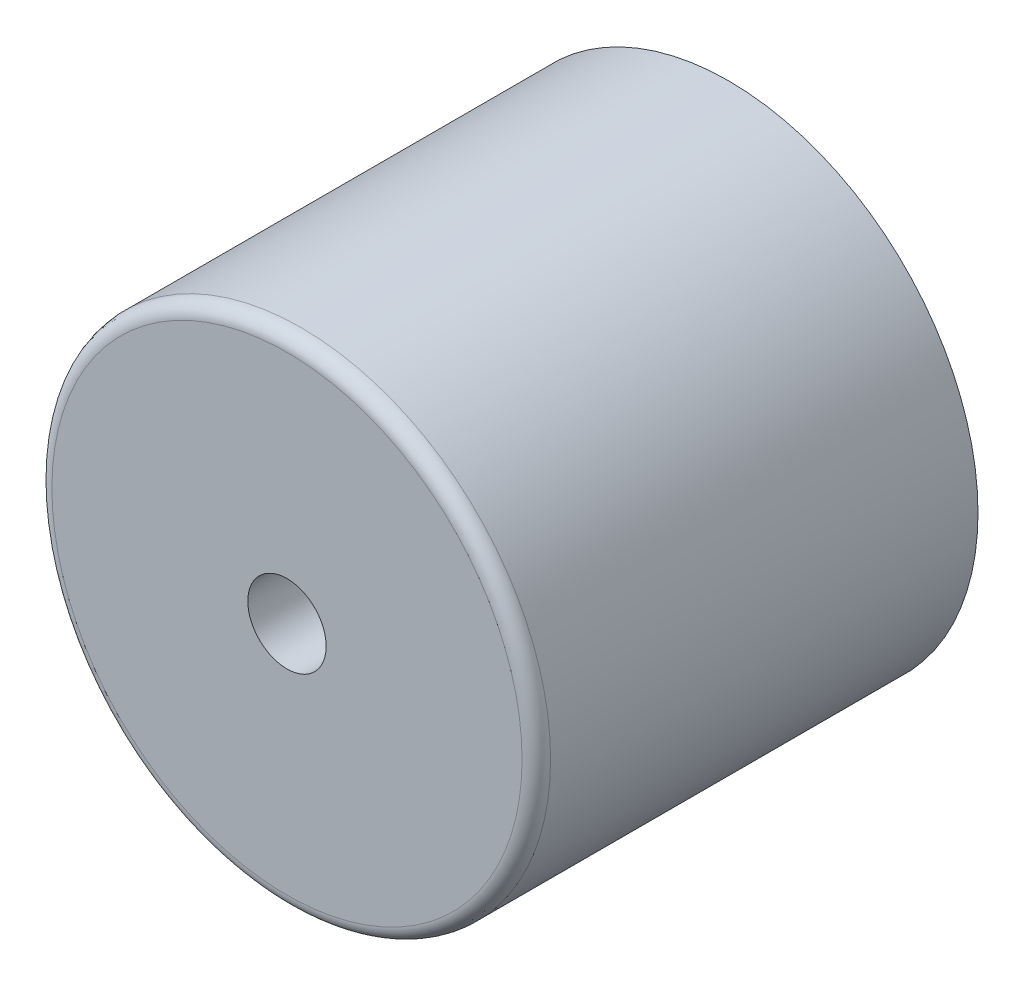
ISO-10303-21;
HEADER;
FILE_DESCRIPTION(('STEP AP214'),'2;1');
FILE_NAME('part.step','',(''),(''),'','','');
FILE_SCHEMA(('AUTOMOTIVE_DESIGN { 1 0 10303 214 1 1 1 1 }'));
ENDSEC;
DATA;
#1=APPLICATION_CONTEXT('core data for automotive mechanical design processes');
#2=APPLICATION_PROTOCOL_DEFINITION('international standard','automotive_design',2000,#1);
#3=PRODUCT_CONTEXT('',#1,'mechanical');
#4=PRODUCT('Part','Part','',(#3));
#5=PRODUCT_RELATED_PRODUCT_CATEGORY('part','',(#4));
#6=PRODUCT_DEFINITION_FORMATION('','',#4);
#7=PRODUCT_DEFINITION_CONTEXT('part definition',#1,'design');
#8=PRODUCT_DEFINITION('design','',#6,#7);
#9=PRODUCT_DEFINITION_SHAPE('','',#8);
#10=(LENGTH_UNIT() NAMED_UNIT(*) SI_UNIT(.MILLI.,.METRE.));
#11=(NAMED_UNIT(*) PLANE_ANGLE_UNIT() SI_UNIT($,.RADIAN.));
#12=(NAMED_UNIT(*) SI_UNIT($,.STERADIAN.) SOLID_ANGLE_UNIT());
#13=UNCERTAINTY_MEASURE_WITH_UNIT(LENGTH_MEASURE(1.E-05),#10,'distance_accuracy_value','');
#14=(GEOMETRIC_REPRESENTATION_CONTEXT(3) GLOBAL_UNCERTAINTY_ASSIGNED_CONTEXT((#13)) GLOBAL_UNIT_ASSIGNED_CONTEXT((#10,
#11,#12)) REPRESENTATION_CONTEXT('',''));
#15=CARTESIAN_POINT('',(0.,0.,0.));
#16=DIRECTION('',(0.,0.,1.));
#17=DIRECTION('',(1.,0.,0.));
#18=AXIS2_PLACEMENT_3D('',#15,#16,#17);
#19=CARTESIAN_POINT('',(0.,0.,31.));
#20=DIRECTION('',(0.,0.,-1.));
#21=DIRECTION('',(-1.,0.,0.));
#22=AXIS2_PLACEMENT_3D('',#19,#20,#21);
#23=CYLINDRICAL_SURFACE('',#22,17.5);
#24=CARTESIAN_POINT('',(0.,0.,30.));
#25=DIRECTION('',(0.,0.,1.));
#26=DIRECTION('',(1.,0.,0.));
#27=AXIS2_PLACEMENT_3D('',#24,#25,#26);
#28=CIRCLE('',#27,17.5);
#29=CARTESIAN_POINT('',(17.5,0.,30.));
#30=VERTEX_POINT('',#29);
#31=EDGE_CURVE('E10',#30,#30,#28,.F.);
#32=ORIENTED_EDGE('',*,*,#31,.T.);
#33=EDGE_LOOP('',(#32));
#34=FACE_BOUND('',#33,.T.);
#35=CARTESIAN_POINT('',(0.,0.,0.));
#36=DIRECTION('',(0.,0.,1.));
#37=DIRECTION('',(1.,0.,0.));
#38=AXIS2_PLACEMENT_3D('',#35,#36,#37);
#39=CIRCLE('',#38,17.5);
#40=CARTESIAN_POINT('',(17.5,0.,0.));
#41=VERTEX_POINT('',#40);
#42=EDGE_CURVE('E50',#41,#41,#39,.T.);
#43=ORIENTED_EDGE('',*,*,#42,.T.);
#44=EDGE_LOOP('',(#43));
#45=FACE_BOUND('',#44,.T.);
#46=ADVANCED_FACE('F36',(#34,#45),#23,.T.);
#47=CARTESIAN_POINT('',(0.,0.,31.));
#48=DIRECTION('',(0.,0.,1.));
#49=DIRECTION('',(1.,0.,0.));
#50=AXIS2_PLACEMENT_3D('',#47,#48,#49);
#51=PLANE('',#50);
#52=CARTESIAN_POINT('',(0.,0.,31.));
#53=DIRECTION('',(0.,0.,1.));
#54=DIRECTION('',(1.,0.,0.));
#55=AXIS2_PLACEMENT_3D('',#52,#53,#54);
#56=CIRCLE('',#55,2.75);
#57=CARTESIAN_POINT('',(2.75,0.,31.));
#58=VERTEX_POINT('',#57);
#59=EDGE_CURVE('E72',#58,#58,#56,.T.);
#60=ORIENTED_EDGE('',*,*,#59,.F.);
#61=EDGE_LOOP('',(#60));
#62=FACE_BOUND('',#61,.T.);
#63=CARTESIAN_POINT('',(0.,0.,31.));
#64=DIRECTION('',(0.,0.,1.));
#65=DIRECTION('',(1.,0.,0.));
#66=AXIS2_PLACEMENT_3D('',#63,#64,#65);
#67=CIRCLE('',#66,16.5);
#68=CARTESIAN_POINT('',(16.5,0.,31.));
#69=VERTEX_POINT('',#68);
#70=EDGE_CURVE('E45',#69,#69,#67,.T.);
#71=ORIENTED_EDGE('',*,*,#70,.T.);
#72=EDGE_LOOP('',(#71));
#73=FACE_BOUND('',#72,.T.);
#74=ADVANCED_FACE('F106',(#62,#73),#51,.T.);
#75=CARTESIAN_POINT('',(0.,0.,0.));
#76=DIRECTION('',(0.,0.,1.));
#77=DIRECTION('',(1.,0.,0.));
#78=AXIS2_PLACEMENT_3D('',#75,#76,#77);
#79=PLANE('',#78);
#80=CARTESIAN_POINT('',(0.,0.,0.));
#81=DIRECTION('',(0.,0.,-1.));
#82=DIRECTION('',(-1.,0.,0.));
#83=AXIS2_PLACEMENT_3D('',#80,#81,#82);
#84=CIRCLE('',#83,16.);
#85=CARTESIAN_POINT('',(-16.,0.,0.));
#86=VERTEX_POINT('',#85);
#87=EDGE_CURVE('E64',#86,#86,#84,.T.);
#88=ORIENTED_EDGE('',*,*,#87,.F.);
#89=EDGE_LOOP('',(#88));
#90=FACE_BOUND('',#89,.T.);
#91=ORIENTED_EDGE('',*,*,#42,.F.);
#92=EDGE_LOOP('',(#91));
#93=FACE_BOUND('',#92,.T.);
#94=ADVANCED_FACE('F111',(#90,#93),#79,.F.);
#95=CARTESIAN_POINT('',(0.,0.,30.));
#96=DIRECTION('',(0.,0.,1.));
#97=DIRECTION('',(1.,0.,0.));
#98=AXIS2_PLACEMENT_3D('',#95,#96,#97);
#99=TOROIDAL_SURFACE('',#98,16.5,1.);
#100=ORIENTED_EDGE('',*,*,#31,.F.);
#101=EDGE_LOOP('',(#100));
#102=FACE_BOUND('',#101,.T.);
#103=ORIENTED_EDGE('',*,*,#70,.F.);
#104=EDGE_LOOP('',(#103));
#105=FACE_BOUND('',#104,.T.);
#106=ADVANCED_FACE('F38',(#102,#105),#99,.T.);
#107=CARTESIAN_POINT('',(0.,0.,0.));
#108=DIRECTION('',(0.,0.,-1.));
#109=DIRECTION('',(-1.,0.,0.));
#110=AXIS2_PLACEMENT_3D('',#107,#108,#109);
#111=CONICAL_SURFACE('',#110,16.,0.283794109208328);
#112=CARTESIAN_POINT('',(0.,0.,6.));
#113=DIRECTION('',(0.,0.,-1.));
#114=DIRECTION('',(-1.,0.,0.));
#115=AXIS2_PLACEMENT_3D('',#112,#113,#114);
#116=CIRCLE('',#115,14.25);
#117=CARTESIAN_POINT('',(-14.25,0.,6.));
#118=VERTEX_POINT('',#117);
#119=EDGE_CURVE('E60',#118,#118,#116,.T.);
#120=ORIENTED_EDGE('',*,*,#119,.F.);
#121=EDGE_LOOP('',(#120));
#122=FACE_BOUND('',#121,.T.);
#123=ORIENTED_EDGE('',*,*,#87,.T.);
#124=EDGE_LOOP('',(#123));
#125=FACE_BOUND('',#124,.T.);
#126=ADVANCED_FACE('F93',(#122,#125),#111,.F.);
#127=CARTESIAN_POINT('',(0.,0.,14.));
#128=DIRECTION('',(0.,0.,-1.));
#129=DIRECTION('',(-1.,0.,0.));
#130=AXIS2_PLACEMENT_3D('',#127,#128,#129);
#131=PLANE('',#130);
#132=CARTESIAN_POINT('',(0.,0.,14.));
#133=DIRECTION('',(0.,0.,-1.));
#134=DIRECTION('',(-1.,0.,0.));
#135=AXIS2_PLACEMENT_3D('',#132,#133,#134);
#136=CIRCLE('',#135,9.25);
#137=CARTESIAN_POINT('',(-9.24999999999999,0.,14.));
#138=VERTEX_POINT('',#137);
#139=EDGE_CURVE('E68',#138,#138,#136,.T.);
#140=ORIENTED_EDGE('',*,*,#139,.F.);
#141=EDGE_LOOP('',(#140));
#142=FACE_BOUND('',#141,.T.);
#143=CARTESIAN_POINT('',(0.,0.,14.));
#144=DIRECTION('',(0.,0.,-1.));
#145=DIRECTION('',(-1.,0.,0.));
#146=AXIS2_PLACEMENT_3D('',#143,#144,#145);
#147=CIRCLE('',#146,14.25);
#148=CARTESIAN_POINT('',(-14.25,0.,14.));
#149=VERTEX_POINT('',#148);
#150=EDGE_CURVE('E56',#149,#149,#147,.T.);
#151=ORIENTED_EDGE('',*,*,#150,.T.);
#152=EDGE_LOOP('',(#151));
#153=FACE_BOUND('',#152,.T.);
#154=ADVANCED_FACE('F90',(#142,#153),#131,.T.);
#155=CARTESIAN_POINT('',(0.,0.,14.));
#156=DIRECTION('',(0.,0.,-1.));
#157=DIRECTION('',(-1.,0.,0.));
#158=AXIS2_PLACEMENT_3D('',#155,#156,#157);
#159=CYLINDRICAL_SURFACE('',#158,14.25);
#160=ORIENTED_EDGE('',*,*,#119,.T.);
#161=EDGE_LOOP('',(#160));
#162=FACE_BOUND('',#161,.T.);
#163=ORIENTED_EDGE('',*,*,#150,.F.);
#164=EDGE_LOOP('',(#163));
#165=FACE_BOUND('',#164,.T.);
#166=ADVANCED_FACE('F86',(#162,#165),#159,.F.);
#167=CARTESIAN_POINT('',(0.,0.,18.7));
#168=DIRECTION('',(0.,0.,-1.));
#169=DIRECTION('',(-1.,0.,0.));
#170=AXIS2_PLACEMENT_3D('',#167,#168,#169);
#171=CONICAL_SURFACE('',#170,0.249999999999999,1.08952939589646);
#172=CARTESIAN_POINT('',(0.,0.,17.3944444444444));
#173=DIRECTION('',(0.,0.,-1.));
#174=DIRECTION('',(-1.,0.,0.));
#175=AXIS2_PLACEMENT_3D('',#172,#173,#174);
#176=CIRCLE('',#175,2.74999999999999);
#177=CARTESIAN_POINT('',(-2.75,0.,17.3944444444444));
#178=VERTEX_POINT('',#177);
#179=EDGE_CURVE('E40',#178,#178,#176,.T.);
#180=CARTESIAN_POINT('',(-2.75,0.,17.3944444444444));
#181=CARTESIAN_POINT('',(-2.81770833333333,0.,17.3590856481481));
#182=CARTESIAN_POINT('',(-2.88541666666666,0.,17.3237268518518));
#183=CARTESIAN_POINT('',(-3.02083333333333,0.,17.2530092592593));
#184=CARTESIAN_POINT('',(-3.08854166666666,0.,17.217650462963));
#185=CARTESIAN_POINT('',(-3.22395833333333,0.,17.1469328703704));
#186=CARTESIAN_POINT('',(-3.29166666666666,0.,17.1115740740741));
#187=CARTESIAN_POINT('',(-3.42708333333333,0.,17.0408564814815));
#188=CARTESIAN_POINT('',(-3.49479166666666,0.,17.0054976851852));
#189=CARTESIAN_POINT('',(-3.63020833333333,0.,16.9347800925926));
#190=CARTESIAN_POINT('',(-3.69791666666666,0.,16.8994212962963));
#191=CARTESIAN_POINT('',(-3.83333333333333,0.,16.8287037037037));
#192=CARTESIAN_POINT('',(-3.90104166666666,0.,16.7933449074074));
#193=CARTESIAN_POINT('',(-4.03645833333333,0.,16.7226273148148));
#194=CARTESIAN_POINT('',(-4.10416666666666,0.,16.6872685185185));
#195=CARTESIAN_POINT('',(-4.23958333333333,0.,16.6165509259259));
#196=CARTESIAN_POINT('',(-4.30729166666666,0.,16.5811921296296));
#197=CARTESIAN_POINT('',(-4.44270833333333,0.,16.510474537037));
#198=CARTESIAN_POINT('',(-4.51041666666666,0.,16.4751157407407));
#199=CARTESIAN_POINT('',(-4.64583333333333,0.,16.4043981481481));
#200=CARTESIAN_POINT('',(-4.71354166666666,0.,16.3690393518518));
#201=CARTESIAN_POINT('',(-4.84895833333333,0.,16.2983217592592));
#202=CARTESIAN_POINT('',(-4.91666666666666,0.,16.262962962963));
#203=CARTESIAN_POINT('',(-5.05208333333333,0.,16.1922453703704));
#204=CARTESIAN_POINT('',(-5.11979166666666,0.,16.1568865740741));
#205=CARTESIAN_POINT('',(-5.25520833333333,0.,16.0861689814815));
#206=CARTESIAN_POINT('',(-5.32291666666666,0.,16.0508101851852));
#207=CARTESIAN_POINT('',(-5.45833333333333,0.,15.9800925925926));
#208=CARTESIAN_POINT('',(-5.52604166666666,0.,15.9447337962963));
#209=CARTESIAN_POINT('',(-5.66145833333333,0.,15.8740162037037));
#210=CARTESIAN_POINT('',(-5.72916666666666,0.,15.8386574074074));
#211=CARTESIAN_POINT('',(-5.86458333333333,0.,15.7679398148148));
#212=CARTESIAN_POINT('',(-5.93229166666666,0.,15.7325810185185));
#213=CARTESIAN_POINT('',(-6.06770833333333,0.,15.6618634259259));
#214=CARTESIAN_POINT('',(-6.13541666666666,0.,15.6265046296296));
#215=CARTESIAN_POINT('',(-6.27083333333333,0.,15.555787037037));
#216=CARTESIAN_POINT('',(-6.33854166666666,0.,15.5204282407407));
#217=CARTESIAN_POINT('',(-6.47395833333333,0.,15.4497106481481));
#218=CARTESIAN_POINT('',(-6.54166666666666,0.,15.4143518518518));
#219=CARTESIAN_POINT('',(-6.67708333333333,0.,15.3436342592592));
#220=CARTESIAN_POINT('',(-6.74479166666666,0.,15.3082754629629));
#221=CARTESIAN_POINT('',(-6.88020833333333,0.,15.2375578703704));
#222=CARTESIAN_POINT('',(-6.94791666666666,0.,15.2021990740741));
#223=CARTESIAN_POINT('',(-7.08333333333333,0.,15.1314814814815));
#224=CARTESIAN_POINT('',(-7.15104166666666,0.,15.0961226851852));
#225=CARTESIAN_POINT('',(-7.28645833333333,0.,15.0254050925926));
#226=CARTESIAN_POINT('',(-7.35416666666666,0.,14.9900462962963));
#227=CARTESIAN_POINT('',(-7.48958333333333,0.,14.9193287037037));
#228=CARTESIAN_POINT('',(-7.55729166666666,0.,14.8839699074074));
#229=CARTESIAN_POINT('',(-7.69270833333333,0.,14.8132523148148));
#230=CARTESIAN_POINT('',(-7.76041666666666,0.,14.7778935185185));
#231=CARTESIAN_POINT('',(-7.89583333333333,0.,14.7071759259259));
#232=CARTESIAN_POINT('',(-7.96354166666666,0.,14.6718171296296));
#233=CARTESIAN_POINT('',(-8.09895833333333,0.,14.601099537037));
#234=CARTESIAN_POINT('',(-8.16666666666666,0.,14.5657407407407));
#235=CARTESIAN_POINT('',(-8.30208333333333,0.,14.4950231481481));
#236=CARTESIAN_POINT('',(-8.36979166666666,0.,14.4596643518518));
#237=CARTESIAN_POINT('',(-8.50520833333333,0.,14.3889467592592));
#238=CARTESIAN_POINT('',(-8.57291666666666,0.,14.3535879629629));
#239=CARTESIAN_POINT('',(-8.70833333333333,0.,14.2828703703704));
#240=CARTESIAN_POINT('',(-8.77604166666666,0.,14.2475115740741));
#241=CARTESIAN_POINT('',(-8.91145833333333,0.,14.1767939814815));
#242=CARTESIAN_POINT('',(-8.97916666666666,0.,14.1414351851852));
#243=CARTESIAN_POINT('',(-9.11458333333333,0.,14.0707175925926));
#244=CARTESIAN_POINT('',(-9.18229166666666,0.,14.0353587962963));
#245=CARTESIAN_POINT('',(-9.24999999999999,0.,14.));
#246=B_SPLINE_CURVE_WITH_KNOTS('',3,(#180,#181,#182,#183,#184,#185,#186,#187,#188,#189,#190,
#191,#192,#193,#194,#195,#196,#197,#198,#199,#200,#201,#202,#203,#204,#205,#206,#207,#208,#209,
#210,#211,#212,#213,#214,#215,#216,#217,#218,#219,#220,#221,#222,#223,#224,#225,#226,#227,#228,
#229,#230,#231,#232,#233,#234,#235,#236,#237,#238,#239,#240,#241,#242,#243,#244,#245),
.UNSPECIFIED.,.F.,.F.,(4,2,2,2,2,2,2,2,2,2,2,2,2,2,2,2,2,2,2,2,2,2,2,2,2,2,2,2,2,2,2,2,4),(0.,
0.2291548950049,0.458309790009801,0.687464685014701,0.916619580019603,1.1457744750245,
1.3749293700294,1.6040842650343,1.8332391600392,2.06239405504411,2.291548950049,2.5207038450539,
2.74985874005881,2.97901363506371,3.2081685300686,3.4373234250735,3.66647832007841,
3.89563321508331,4.1247881100882,4.35394300509311,4.58309790009801,4.81225279510291,
5.04140769010781,5.27056258511271,5.49971748011761,5.7288723751225,5.95802727012741,
6.18718216513231,6.41633706013721,6.64549195514211,6.87464685014701,7.10380174515191,
7.33295664015681),.UNSPECIFIED.);
#247=EDGE_CURVE('BSEAM83',#178,#138,#246,.T.);
#248=ORIENTED_EDGE('',*,*,#179,.F.);
#249=ORIENTED_EDGE('',*,*,#139,.T.);
#250=ORIENTED_EDGE('',*,*,#247,.T.);
#251=ORIENTED_EDGE('',*,*,#247,.F.);
#252=EDGE_LOOP('',(#248,#250,#249,#251));
#253=FACE_BOUND('',#252,.T.);
#254=ADVANCED_FACE('F83',(#253),#171,.F.);
#255=CARTESIAN_POINT('',(0.,0.,31.));
#256=DIRECTION('',(0.,0.,1.));
#257=DIRECTION('',(1.,0.,0.));
#258=AXIS2_PLACEMENT_3D('',#255,#256,#257);
#259=CYLINDRICAL_SURFACE('',#258,2.74999999999999);
#260=ORIENTED_EDGE('',*,*,#179,.T.);
#261=EDGE_LOOP('',(#260));
#262=FACE_BOUND('',#261,.T.);
#263=ORIENTED_EDGE('',*,*,#59,.T.);
#264=EDGE_LOOP('',(#263));
#265=FACE_BOUND('',#264,.T.);
#266=ADVANCED_FACE('F81',(#262,#265),#259,.F.);
#267=CLOSED_SHELL('',(#46,#74,#94,#106,#126,#154,#166,#254,#266));
#268=MANIFOLD_SOLID_BREP('B2',#267);
#269=ADVANCED_BREP_SHAPE_REPRESENTATION('',(#18,#268),#14);
#270=SHAPE_DEFINITION_REPRESENTATION(#9,#269);
ENDSEC;
END-ISO-10303-21;
